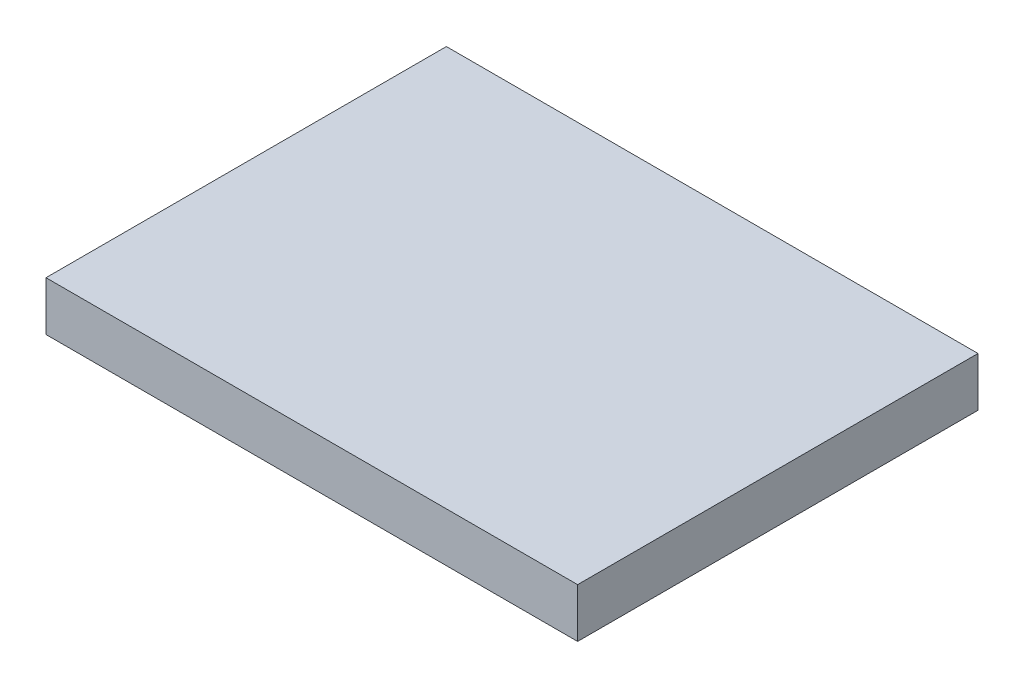
ISO-10303-21;
HEADER;
FILE_DESCRIPTION(('STEP AP214'),'2;1');
FILE_NAME('part.step','',(''),(''),'','','');
FILE_SCHEMA(('AUTOMOTIVE_DESIGN { 1 0 10303 214 1 1 1 1 }'));
ENDSEC;
DATA;
#1=APPLICATION_CONTEXT('core data for automotive mechanical design processes');
#2=APPLICATION_PROTOCOL_DEFINITION('international standard','automotive_design',2000,#1);
#3=PRODUCT_CONTEXT('',#1,'mechanical');
#4=PRODUCT('Part','Part','',(#3));
#5=PRODUCT_RELATED_PRODUCT_CATEGORY('part','',(#4));
#6=PRODUCT_DEFINITION_FORMATION('','',#4);
#7=PRODUCT_DEFINITION_CONTEXT('part definition',#1,'design');
#8=PRODUCT_DEFINITION('design','',#6,#7);
#9=PRODUCT_DEFINITION_SHAPE('','',#8);
#10=(LENGTH_UNIT() NAMED_UNIT(*) SI_UNIT(.MILLI.,.METRE.));
#11=(NAMED_UNIT(*) PLANE_ANGLE_UNIT() SI_UNIT($,.RADIAN.));
#12=(NAMED_UNIT(*) SI_UNIT($,.STERADIAN.) SOLID_ANGLE_UNIT());
#13=UNCERTAINTY_MEASURE_WITH_UNIT(LENGTH_MEASURE(1.E-05),#10,'distance_accuracy_value','');
#14=(GEOMETRIC_REPRESENTATION_CONTEXT(3) GLOBAL_UNCERTAINTY_ASSIGNED_CONTEXT((#13)) GLOBAL_UNIT_ASSIGNED_CONTEXT((#10,
#11,#12)) REPRESENTATION_CONTEXT('',''));
#15=CARTESIAN_POINT('',(0.,0.,0.));
#16=DIRECTION('',(0.,0.,1.));
#17=DIRECTION('',(1.,0.,0.));
#18=AXIS2_PLACEMENT_3D('',#15,#16,#17);
#19=CARTESIAN_POINT('',(34.064967999985,4.793678,-30.567962));
#20=DIRECTION('',(0.,-1.,0.));
#21=DIRECTION('',(0.,0.,-1.));
#22=AXIS2_PLACEMENT_3D('',#19,#20,#21);
#23=PLANE('',#22);
#24=DIRECTION('',(1.,0.,0.));
#25=VECTOR('',#24,1.);
#26=CARTESIAN_POINT('',(42.166551999985,4.793678,-24.466374));
#27=LINE('',#26,#25);
#28=CARTESIAN_POINT('',(25.963383999985,4.793678,-24.466374));
#29=VERTEX_POINT('',#28);
#30=CARTESIAN_POINT('',(42.166551999985,4.793678,-24.466374));
#31=VERTEX_POINT('',#30);
#32=EDGE_CURVE('E68',#29,#31,#27,.T.);
#33=ORIENTED_EDGE('',*,*,#32,.F.);
#34=DIRECTION('',(0.,0.,1.));
#35=VECTOR('',#34,1.);
#36=CARTESIAN_POINT('',(25.963383999985,4.793678,-24.466374));
#37=LINE('',#36,#35);
#38=CARTESIAN_POINT('',(25.963383999985,4.793678,-36.66955));
#39=VERTEX_POINT('',#38);
#40=EDGE_CURVE('E20',#39,#29,#37,.T.);
#41=ORIENTED_EDGE('',*,*,#40,.F.);
#42=DIRECTION('',(-1.,0.,0.));
#43=VECTOR('',#42,1.);
#44=CARTESIAN_POINT('',(25.963383999985,4.793678,-36.66955));
#45=LINE('',#44,#43);
#46=CARTESIAN_POINT('',(42.166551999985,4.793678,-36.66955));
#47=VERTEX_POINT('',#46);
#48=EDGE_CURVE('E58',#47,#39,#45,.T.);
#49=ORIENTED_EDGE('',*,*,#48,.F.);
#50=DIRECTION('',(0.,0.,-1.));
#51=VECTOR('',#50,1.);
#52=CARTESIAN_POINT('',(42.166551999985,4.793678,-36.66955));
#53=LINE('',#52,#51);
#54=EDGE_CURVE('E53',#31,#47,#53,.T.);
#55=ORIENTED_EDGE('',*,*,#54,.F.);
#56=EDGE_LOOP('',(#33,#41,#49,#55));
#57=FACE_BOUND('',#56,.T.);
#58=ADVANCED_FACE('F17',(#57),#23,.T.);
#59=CARTESIAN_POINT('',(25.963383999985,6.293802,-24.466374));
#60=DIRECTION('',(-1.,0.,0.));
#61=DIRECTION('',(0.,0.,1.));
#62=AXIS2_PLACEMENT_3D('',#59,#60,#61);
#63=PLANE('',#62);
#64=DIRECTION('',(0.,1.,0.));
#65=VECTOR('',#64,1.);
#66=CARTESIAN_POINT('',(25.963383999985,6.293802,-24.466374));
#67=LINE('',#66,#65);
#68=CARTESIAN_POINT('',(25.963383999985,6.293802,-24.466374));
#69=VERTEX_POINT('',#68);
#70=EDGE_CURVE('E79',#69,#29,#67,.F.);
#71=ORIENTED_EDGE('',*,*,#70,.F.);
#72=DIRECTION('',(0.,0.,-1.));
#73=VECTOR('',#72,1.);
#74=CARTESIAN_POINT('',(25.963383999985,6.293802,-30.567962));
#75=LINE('',#74,#73);
#76=CARTESIAN_POINT('',(25.963383999985,6.293802,-36.66955));
#77=VERTEX_POINT('',#76);
#78=EDGE_CURVE('E74',#69,#77,#75,.T.);
#79=ORIENTED_EDGE('',*,*,#78,.T.);
#80=DIRECTION('',(0.,1.,0.));
#81=VECTOR('',#80,1.);
#82=CARTESIAN_POINT('',(25.963383999985,6.293802,-36.66955));
#83=LINE('',#82,#81);
#84=EDGE_CURVE('E63',#39,#77,#83,.T.);
#85=ORIENTED_EDGE('',*,*,#84,.F.);
#86=ORIENTED_EDGE('',*,*,#40,.T.);
#87=EDGE_LOOP('',(#71,#79,#85,#86));
#88=FACE_BOUND('',#87,.T.);
#89=ADVANCED_FACE('F73',(#88),#63,.T.);
#90=CARTESIAN_POINT('',(25.963383999985,6.293802,-36.66955));
#91=DIRECTION('',(0.,0.,-1.));
#92=DIRECTION('',(-1.,0.,0.));
#93=AXIS2_PLACEMENT_3D('',#90,#91,#92);
#94=PLANE('',#93);
#95=ORIENTED_EDGE('',*,*,#84,.T.);
#96=DIRECTION('',(1.,0.,0.));
#97=VECTOR('',#96,1.);
#98=CARTESIAN_POINT('',(34.064967999985,6.293802,-36.66955));
#99=LINE('',#98,#97);
#100=CARTESIAN_POINT('',(42.166551999985,6.293802,-36.66955));
#101=VERTEX_POINT('',#100);
#102=EDGE_CURVE('E84',#77,#101,#99,.T.);
#103=ORIENTED_EDGE('',*,*,#102,.T.);
#104=DIRECTION('',(0.,1.,0.));
#105=VECTOR('',#104,1.);
#106=CARTESIAN_POINT('',(42.166551999985,6.293802,-36.66955));
#107=LINE('',#106,#105);
#108=EDGE_CURVE('E65',#47,#101,#107,.T.);
#109=ORIENTED_EDGE('',*,*,#108,.F.);
#110=ORIENTED_EDGE('',*,*,#48,.T.);
#111=EDGE_LOOP('',(#95,#103,#109,#110));
#112=FACE_BOUND('',#111,.T.);
#113=ADVANCED_FACE('F60',(#112),#94,.T.);
#114=CARTESIAN_POINT('',(42.166551999985,6.293802,-36.66955));
#115=DIRECTION('',(1.,0.,0.));
#116=DIRECTION('',(0.,0.,-1.));
#117=AXIS2_PLACEMENT_3D('',#114,#115,#116);
#118=PLANE('',#117);
#119=ORIENTED_EDGE('',*,*,#108,.T.);
#120=DIRECTION('',(0.,0.,-1.));
#121=VECTOR('',#120,1.);
#122=CARTESIAN_POINT('',(42.166551999985,6.293802,-30.567962));
#123=LINE('',#122,#121);
#124=CARTESIAN_POINT('',(42.166551999985,6.293802,-24.466374));
#125=VERTEX_POINT('',#124);
#126=EDGE_CURVE('E26',#101,#125,#123,.F.);
#127=ORIENTED_EDGE('',*,*,#126,.T.);
#128=DIRECTION('',(0.,1.,0.));
#129=VECTOR('',#128,1.);
#130=CARTESIAN_POINT('',(42.166551999985,6.293802,-24.466374));
#131=LINE('',#130,#129);
#132=EDGE_CURVE('E34',#31,#125,#131,.T.);
#133=ORIENTED_EDGE('',*,*,#132,.F.);
#134=ORIENTED_EDGE('',*,*,#54,.T.);
#135=EDGE_LOOP('',(#119,#127,#133,#134));
#136=FACE_BOUND('',#135,.T.);
#137=ADVANCED_FACE('F88',(#136),#118,.T.);
#138=CARTESIAN_POINT('',(42.166551999985,6.293802,-24.466374));
#139=DIRECTION('',(0.,0.,1.));
#140=DIRECTION('',(1.,0.,0.));
#141=AXIS2_PLACEMENT_3D('',#138,#139,#140);
#142=PLANE('',#141);
#143=ORIENTED_EDGE('',*,*,#132,.T.);
#144=DIRECTION('',(1.,0.,0.));
#145=VECTOR('',#144,1.);
#146=CARTESIAN_POINT('',(34.064967999985,6.293802,-24.466374));
#147=LINE('',#146,#145);
#148=EDGE_CURVE('E11',#125,#69,#147,.F.);
#149=ORIENTED_EDGE('',*,*,#148,.T.);
#150=ORIENTED_EDGE('',*,*,#70,.T.);
#151=ORIENTED_EDGE('',*,*,#32,.T.);
#152=EDGE_LOOP('',(#143,#149,#150,#151));
#153=FACE_BOUND('',#152,.T.);
#154=ADVANCED_FACE('F91',(#153),#142,.T.);
#155=CARTESIAN_POINT('',(34.064967999985,6.293802,-30.567962));
#156=DIRECTION('',(0.,-1.,0.));
#157=DIRECTION('',(0.,0.,-1.));
#158=AXIS2_PLACEMENT_3D('',#155,#156,#157);
#159=PLANE('',#158);
#160=ORIENTED_EDGE('',*,*,#126,.F.);
#161=ORIENTED_EDGE('',*,*,#102,.F.);
#162=ORIENTED_EDGE('',*,*,#78,.F.);
#163=ORIENTED_EDGE('',*,*,#148,.F.);
#164=EDGE_LOOP('',(#160,#161,#162,#163));
#165=FACE_BOUND('',#164,.T.);
#166=ADVANCED_FACE('F90',(#165),#159,.F.);
#167=CLOSED_SHELL('',(#58,#89,#113,#137,#154,#166));
#168=MANIFOLD_SOLID_BREP('B1',#167);
#169=ADVANCED_BREP_SHAPE_REPRESENTATION('',(#18,#168),#14);
#170=SHAPE_DEFINITION_REPRESENTATION(#9,#169);
ENDSEC;
END-ISO-10303-21;
